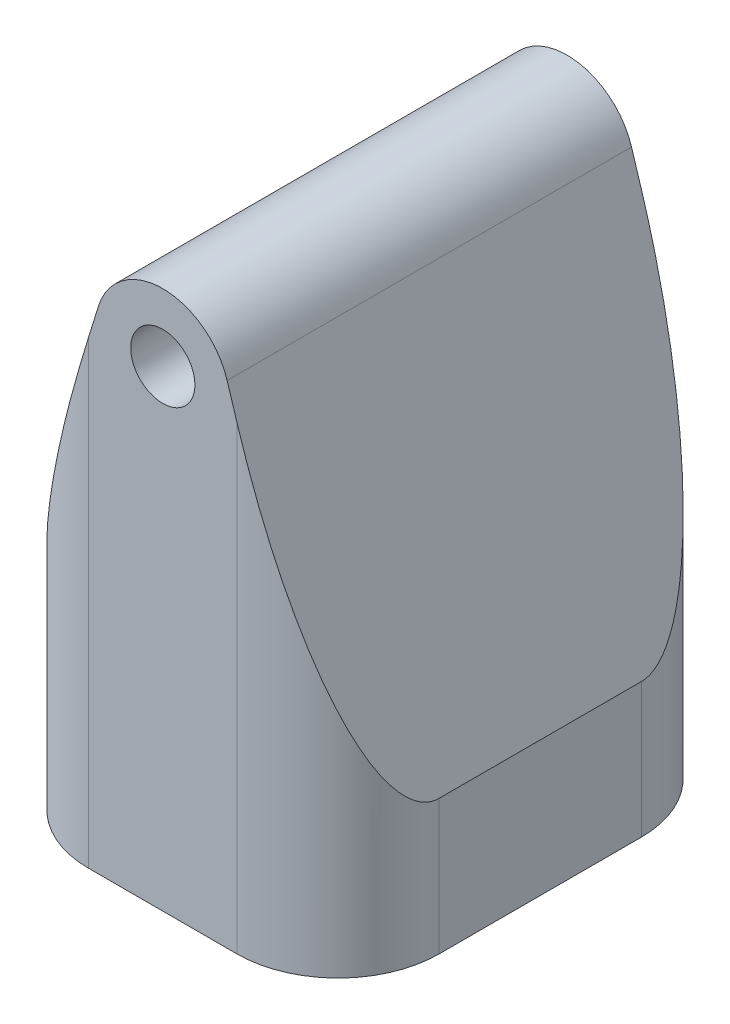
ISO-10303-21;
HEADER;
FILE_DESCRIPTION(('STEP AP214'),'2;1');
FILE_NAME('part.step','',(''),(''),'','','');
FILE_SCHEMA(('AUTOMOTIVE_DESIGN { 1 0 10303 214 1 1 1 1 }'));
ENDSEC;
DATA;
#1=APPLICATION_CONTEXT('core data for automotive mechanical design processes');
#2=APPLICATION_PROTOCOL_DEFINITION('international standard','automotive_design',2000,#1);
#3=PRODUCT_CONTEXT('',#1,'mechanical');
#4=PRODUCT('Part','Part','',(#3));
#5=PRODUCT_RELATED_PRODUCT_CATEGORY('part','',(#4));
#6=PRODUCT_DEFINITION_FORMATION('','',#4);
#7=PRODUCT_DEFINITION_CONTEXT('part definition',#1,'design');
#8=PRODUCT_DEFINITION('design','',#6,#7);
#9=PRODUCT_DEFINITION_SHAPE('','',#8);
#10=(LENGTH_UNIT() NAMED_UNIT(*) SI_UNIT(.MILLI.,.METRE.));
#11=(NAMED_UNIT(*) PLANE_ANGLE_UNIT() SI_UNIT($,.RADIAN.));
#12=(NAMED_UNIT(*) SI_UNIT($,.STERADIAN.) SOLID_ANGLE_UNIT());
#13=UNCERTAINTY_MEASURE_WITH_UNIT(LENGTH_MEASURE(1.E-05),#10,'distance_accuracy_value','');
#14=(GEOMETRIC_REPRESENTATION_CONTEXT(3) GLOBAL_UNCERTAINTY_ASSIGNED_CONTEXT((#13)) GLOBAL_UNIT_ASSIGNED_CONTEXT((#10,
#11,#12)) REPRESENTATION_CONTEXT('',''));
#15=CARTESIAN_POINT('',(0.,0.,0.));
#16=DIRECTION('',(0.,0.,1.));
#17=DIRECTION('',(1.,0.,0.));
#18=AXIS2_PLACEMENT_3D('',#15,#16,#17);
#19=CARTESIAN_POINT('',(13.,-20.,-15.));
#20=DIRECTION('',(0.,0.,1.));
#21=DIRECTION('',(1.,0.,0.));
#22=AXIS2_PLACEMENT_3D('',#19,#20,#21);
#23=PLANE('',#22);
#24=CARTESIAN_POINT('',(0.,15.,-15.));
#25=DIRECTION('',(0.,0.,1.));
#26=DIRECTION('',(1.,0.,0.));
#27=AXIS2_PLACEMENT_3D('',#24,#25,#26);
#28=CIRCLE('',#27,2.38125);
#29=CARTESIAN_POINT('',(2.38125,15.,-15.));
#30=VERTEX_POINT('',#29);
#31=EDGE_CURVE('E202',#30,#30,#28,.T.);
#32=ORIENTED_EDGE('',*,*,#31,.T.);
#33=EDGE_LOOP('',(#32));
#34=FACE_BOUND('',#33,.T.);
#35=DIRECTION('',(-1.,0.,0.));
#36=VECTOR('',#35,1.);
#37=CARTESIAN_POINT('',(13.,-20.,-15.));
#38=LINE('',#37,#36);
#39=CARTESIAN_POINT('',(5.5,-20.,-15.));
#40=VERTEX_POINT('',#39);
#41=CARTESIAN_POINT('',(-5.5,-20.,-15.));
#42=VERTEX_POINT('',#41);
#43=EDGE_CURVE('E227',#40,#42,#38,.T.);
#44=ORIENTED_EDGE('',*,*,#43,.T.);
#45=DIRECTION('',(0.,1.,0.));
#46=VECTOR('',#45,1.);
#47=CARTESIAN_POINT('',(-5.5,-10.,-15.));
#48=LINE('',#47,#46);
#49=CARTESIAN_POINT('',(-5.5,14.1486586582615,-15.));
#50=VERTEX_POINT('',#49);
#51=EDGE_CURVE('E240',#42,#50,#48,.T.);
#52=ORIENTED_EDGE('',*,*,#51,.T.);
#53=DIRECTION('',(0.296600806322939,0.955001550621036,0.));
#54=VECTOR('',#53,1.);
#55=CARTESIAN_POINT('',(-9.02382120241302,2.80258460628595,-15.));
#56=LINE('',#55,#54);
#57=CARTESIAN_POINT('',(-4.77500775310518,16.4830040316147,-15.));
#58=VERTEX_POINT('',#57);
#59=EDGE_CURVE('E183',#50,#58,#56,.T.);
#60=ORIENTED_EDGE('',*,*,#59,.T.);
#61=CARTESIAN_POINT('',(0.,15.,-15.));
#62=DIRECTION('',(0.,0.,1.));
#63=DIRECTION('',(1.,0.,0.));
#64=AXIS2_PLACEMENT_3D('',#61,#62,#63);
#65=CIRCLE('',#64,5.);
#66=CARTESIAN_POINT('',(4.77500775310518,16.4830040316147,-15.));
#67=VERTEX_POINT('',#66);
#68=EDGE_CURVE('E179',#58,#67,#65,.F.);
#69=ORIENTED_EDGE('',*,*,#68,.T.);
#70=DIRECTION('',(-0.296600806322939,0.955001550621036,0.));
#71=VECTOR('',#70,1.);
#72=CARTESIAN_POINT('',(9.02382120241302,2.80258460628595,-15.));
#73=LINE('',#72,#71);
#74=CARTESIAN_POINT('',(5.5,14.1486586582615,-15.));
#75=VERTEX_POINT('',#74);
#76=EDGE_CURVE('E169',#75,#67,#73,.T.);
#77=ORIENTED_EDGE('',*,*,#76,.F.);
#78=DIRECTION('',(0.,1.,0.));
#79=VECTOR('',#78,1.);
#80=CARTESIAN_POINT('',(5.5,-20.,-15.));
#81=LINE('',#80,#79);
#82=EDGE_CURVE('E237',#75,#40,#81,.F.);
#83=ORIENTED_EDGE('',*,*,#82,.T.);
#84=EDGE_LOOP('',(#44,#52,#60,#69,#77,#83));
#85=FACE_BOUND('',#84,.T.);
#86=ADVANCED_FACE('F92',(#34,#85),#23,.F.);
#87=CARTESIAN_POINT('',(13.,-20.,15.));
#88=DIRECTION('',(0.,0.,-1.));
#89=DIRECTION('',(-1.,0.,0.));
#90=AXIS2_PLACEMENT_3D('',#87,#88,#89);
#91=PLANE('',#90);
#92=CARTESIAN_POINT('',(0.,15.,15.));
#93=DIRECTION('',(0.,0.,1.));
#94=DIRECTION('',(1.,0.,0.));
#95=AXIS2_PLACEMENT_3D('',#92,#93,#94);
#96=CIRCLE('',#95,2.38125);
#97=CARTESIAN_POINT('',(2.38125,15.,15.));
#98=VERTEX_POINT('',#97);
#99=EDGE_CURVE('E198',#98,#98,#96,.T.);
#100=ORIENTED_EDGE('',*,*,#99,.F.);
#101=EDGE_LOOP('',(#100));
#102=FACE_BOUND('',#101,.T.);
#103=DIRECTION('',(0.296600806322939,0.955001550621036,0.));
#104=VECTOR('',#103,1.);
#105=CARTESIAN_POINT('',(-9.02382120241302,2.80258460628595,15.));
#106=LINE('',#105,#104);
#107=CARTESIAN_POINT('',(-5.5,14.1486586582615,15.));
#108=VERTEX_POINT('',#107);
#109=CARTESIAN_POINT('',(-4.77500775310518,16.4830040316147,15.));
#110=VERTEX_POINT('',#109);
#111=EDGE_CURVE('E206',#108,#110,#106,.T.);
#112=ORIENTED_EDGE('',*,*,#111,.F.);
#113=DIRECTION('',(0.,-1.,0.));
#114=VECTOR('',#113,1.);
#115=CARTESIAN_POINT('',(-5.5,-20.,15.));
#116=LINE('',#115,#114);
#117=CARTESIAN_POINT('',(-5.5,-20.,15.));
#118=VERTEX_POINT('',#117);
#119=EDGE_CURVE('E270',#108,#118,#116,.T.);
#120=ORIENTED_EDGE('',*,*,#119,.T.);
#121=DIRECTION('',(-1.,0.,0.));
#122=VECTOR('',#121,1.);
#123=CARTESIAN_POINT('',(13.,-20.,15.));
#124=LINE('',#123,#122);
#125=CARTESIAN_POINT('',(5.5,-20.,15.));
#126=VERTEX_POINT('',#125);
#127=EDGE_CURVE('E233',#126,#118,#124,.T.);
#128=ORIENTED_EDGE('',*,*,#127,.F.);
#129=DIRECTION('',(0.,-1.,0.));
#130=VECTOR('',#129,1.);
#131=CARTESIAN_POINT('',(5.5,-20.,15.));
#132=LINE('',#131,#130);
#133=CARTESIAN_POINT('',(5.5,14.1486586582615,15.));
#134=VERTEX_POINT('',#133);
#135=EDGE_CURVE('E267',#126,#134,#132,.F.);
#136=ORIENTED_EDGE('',*,*,#135,.T.);
#137=DIRECTION('',(-0.296600806322939,0.955001550621036,0.));
#138=VECTOR('',#137,1.);
#139=CARTESIAN_POINT('',(9.02382120241302,2.80258460628595,15.));
#140=LINE('',#139,#138);
#141=CARTESIAN_POINT('',(4.77500775310518,16.4830040316147,15.));
#142=VERTEX_POINT('',#141);
#143=EDGE_CURVE('E176',#134,#142,#140,.T.);
#144=ORIENTED_EDGE('',*,*,#143,.T.);
#145=CARTESIAN_POINT('',(0.,15.,15.));
#146=DIRECTION('',(0.,0.,1.));
#147=DIRECTION('',(1.,0.,0.));
#148=AXIS2_PLACEMENT_3D('',#145,#146,#147);
#149=CIRCLE('',#148,5.);
#150=EDGE_CURVE('E193',#110,#142,#149,.F.);
#151=ORIENTED_EDGE('',*,*,#150,.F.);
#152=EDGE_LOOP('',(#112,#120,#128,#136,#144,#151));
#153=FACE_BOUND('',#152,.T.);
#154=ADVANCED_FACE('F309',(#102,#153),#91,.F.);
#155=CARTESIAN_POINT('',(13.,0.,0.));
#156=DIRECTION('',(-1.,0.,0.));
#157=DIRECTION('',(0.,0.,1.));
#158=AXIS2_PLACEMENT_3D('',#155,#156,#157);
#159=PLANE('',#158);
#160=DIRECTION('',(0.,0.,1.));
#161=VECTOR('',#160,1.);
#162=CARTESIAN_POINT('',(13.,-10.,-15.));
#163=LINE('',#162,#161);
#164=CARTESIAN_POINT('',(13.,-10.,-7.5));
#165=VERTEX_POINT('',#164);
#166=CARTESIAN_POINT('',(13.,-10.,7.5));
#167=VERTEX_POINT('',#166);
#168=EDGE_CURVE('E195',#165,#167,#163,.T.);
#169=ORIENTED_EDGE('',*,*,#168,.T.);
#170=DIRECTION('',(0.,-1.,0.));
#171=VECTOR('',#170,1.);
#172=CARTESIAN_POINT('',(13.,0.,7.5));
#173=LINE('',#172,#171);
#174=CARTESIAN_POINT('',(13.,-20.,7.5));
#175=VERTEX_POINT('',#174);
#176=EDGE_CURVE('E277',#167,#175,#173,.T.);
#177=ORIENTED_EDGE('',*,*,#176,.T.);
#178=DIRECTION('',(0.,0.,-1.));
#179=VECTOR('',#178,1.);
#180=CARTESIAN_POINT('',(13.,-20.,15.));
#181=LINE('',#180,#179);
#182=CARTESIAN_POINT('',(13.,-20.,-7.5));
#183=VERTEX_POINT('',#182);
#184=EDGE_CURVE('E223',#175,#183,#181,.T.);
#185=ORIENTED_EDGE('',*,*,#184,.T.);
#186=DIRECTION('',(0.,1.,0.));
#187=VECTOR('',#186,1.);
#188=CARTESIAN_POINT('',(13.,0.,-7.5));
#189=LINE('',#188,#187);
#190=EDGE_CURVE('E274',#183,#165,#189,.T.);
#191=ORIENTED_EDGE('',*,*,#190,.T.);
#192=EDGE_LOOP('',(#169,#177,#185,#191));
#193=FACE_BOUND('',#192,.T.);
#194=ADVANCED_FACE('F284',(#193),#159,.F.);
#195=CARTESIAN_POINT('',(13.,-20.,15.));
#196=DIRECTION('',(0.,1.,0.));
#197=DIRECTION('',(0.,0.,1.));
#198=AXIS2_PLACEMENT_3D('',#195,#196,#197);
#199=PLANE('',#198);
#200=CARTESIAN_POINT('',(0.,-20.,10.));
#201=DIRECTION('',(0.,-1.,0.));
#202=DIRECTION('',(0.,0.,-1.));
#203=AXIS2_PLACEMENT_3D('',#200,#201,#202);
#204=CIRCLE('',#203,2.8067);
#205=CARTESIAN_POINT('',(0.,-20.,7.1933));
#206=VERTEX_POINT('',#205);
#207=EDGE_CURVE('E315',#206,#206,#204,.T.);
#208=ORIENTED_EDGE('',*,*,#207,.F.);
#209=EDGE_LOOP('',(#208));
#210=FACE_BOUND('',#209,.T.);
#211=CARTESIAN_POINT('',(0.,-20.,-10.));
#212=DIRECTION('',(0.,-1.,0.));
#213=DIRECTION('',(0.,0.,-1.));
#214=AXIS2_PLACEMENT_3D('',#211,#212,#213);
#215=CIRCLE('',#214,2.8067);
#216=CARTESIAN_POINT('',(0.,-20.,-12.8067));
#217=VERTEX_POINT('',#216);
#218=EDGE_CURVE('E334',#217,#217,#215,.T.);
#219=ORIENTED_EDGE('',*,*,#218,.F.);
#220=EDGE_LOOP('',(#219));
#221=FACE_BOUND('',#220,.T.);
#222=CARTESIAN_POINT('',(-10.,-20.,0.));
#223=DIRECTION('',(0.,-1.,0.));
#224=DIRECTION('',(0.,0.,-1.));
#225=AXIS2_PLACEMENT_3D('',#222,#223,#224);
#226=CIRCLE('',#225,2.8067);
#227=CARTESIAN_POINT('',(-10.,-20.,-2.8067));
#228=VERTEX_POINT('',#227);
#229=EDGE_CURVE('E326',#228,#228,#226,.T.);
#230=ORIENTED_EDGE('',*,*,#229,.F.);
#231=EDGE_LOOP('',(#230));
#232=FACE_BOUND('',#231,.T.);
#233=CARTESIAN_POINT('',(10.,-20.,0.));
#234=DIRECTION('',(0.,-1.,0.));
#235=DIRECTION('',(0.,0.,-1.));
#236=AXIS2_PLACEMENT_3D('',#233,#234,#235);
#237=CIRCLE('',#236,2.8067);
#238=CARTESIAN_POINT('',(10.,-20.,-2.8067));
#239=VERTEX_POINT('',#238);
#240=EDGE_CURVE('E318',#239,#239,#237,.T.);
#241=ORIENTED_EDGE('',*,*,#240,.F.);
#242=EDGE_LOOP('',(#241));
#243=FACE_BOUND('',#242,.T.);
#244=DIRECTION('',(0.,0.,-1.));
#245=VECTOR('',#244,1.);
#246=CARTESIAN_POINT('',(-13.,-20.,15.));
#247=LINE('',#246,#245);
#248=CARTESIAN_POINT('',(-13.,-20.,7.5));
#249=VERTEX_POINT('',#248);
#250=CARTESIAN_POINT('',(-13.,-20.,-7.5));
#251=VERTEX_POINT('',#250);
#252=EDGE_CURVE('E220',#249,#251,#247,.T.);
#253=ORIENTED_EDGE('',*,*,#252,.T.);
#254=CARTESIAN_POINT('',(-5.5,-20.,-7.5));
#255=DIRECTION('',(0.,1.,0.));
#256=DIRECTION('',(0.,0.,1.));
#257=AXIS2_PLACEMENT_3D('',#254,#255,#256);
#258=CIRCLE('',#257,7.5);
#259=EDGE_CURVE('E264',#251,#42,#258,.F.);
#260=ORIENTED_EDGE('',*,*,#259,.T.);
#261=ORIENTED_EDGE('',*,*,#43,.F.);
#262=CARTESIAN_POINT('',(5.5,-20.,-7.5));
#263=DIRECTION('',(0.,1.,0.));
#264=DIRECTION('',(0.,0.,1.));
#265=AXIS2_PLACEMENT_3D('',#262,#263,#264);
#266=CIRCLE('',#265,7.5);
#267=EDGE_CURVE('E255',#40,#183,#266,.F.);
#268=ORIENTED_EDGE('',*,*,#267,.T.);
#269=ORIENTED_EDGE('',*,*,#184,.F.);
#270=CARTESIAN_POINT('',(5.5,-20.,7.5));
#271=DIRECTION('',(0.,1.,0.));
#272=DIRECTION('',(0.,0.,1.));
#273=AXIS2_PLACEMENT_3D('',#270,#271,#272);
#274=CIRCLE('',#273,7.5);
#275=EDGE_CURVE('E258',#175,#126,#274,.F.);
#276=ORIENTED_EDGE('',*,*,#275,.T.);
#277=ORIENTED_EDGE('',*,*,#127,.T.);
#278=CARTESIAN_POINT('',(-5.5,-20.,7.5));
#279=DIRECTION('',(0.,1.,0.));
#280=DIRECTION('',(0.,0.,1.));
#281=AXIS2_PLACEMENT_3D('',#278,#279,#280);
#282=CIRCLE('',#281,7.5);
#283=EDGE_CURVE('E261',#118,#249,#282,.F.);
#284=ORIENTED_EDGE('',*,*,#283,.T.);
#285=EDGE_LOOP('',(#253,#260,#261,#268,#269,#276,#277,#284));
#286=FACE_BOUND('',#285,.T.);
#287=ADVANCED_FACE('F287',(#210,#221,#232,#243,#286),#199,.F.);
#288=CARTESIAN_POINT('',(-13.,0.,0.));
#289=DIRECTION('',(-1.,0.,0.));
#290=DIRECTION('',(0.,0.,1.));
#291=AXIS2_PLACEMENT_3D('',#288,#289,#290);
#292=PLANE('',#291);
#293=DIRECTION('',(0.,0.,1.));
#294=VECTOR('',#293,1.);
#295=CARTESIAN_POINT('',(-13.,-10.,-15.));
#296=LINE('',#295,#294);
#297=CARTESIAN_POINT('',(-13.,-10.,-7.5));
#298=VERTEX_POINT('',#297);
#299=CARTESIAN_POINT('',(-13.,-10.,7.5));
#300=VERTEX_POINT('',#299);
#301=EDGE_CURVE('E216',#298,#300,#296,.T.);
#302=ORIENTED_EDGE('',*,*,#301,.F.);
#303=DIRECTION('',(0.,1.,0.));
#304=VECTOR('',#303,1.);
#305=CARTESIAN_POINT('',(-13.,-20.,-7.5));
#306=LINE('',#305,#304);
#307=EDGE_CURVE('E252',#298,#251,#306,.F.);
#308=ORIENTED_EDGE('',*,*,#307,.T.);
#309=ORIENTED_EDGE('',*,*,#252,.F.);
#310=DIRECTION('',(0.,-1.,0.));
#311=VECTOR('',#310,1.);
#312=CARTESIAN_POINT('',(-13.,-10.,7.5));
#313=LINE('',#312,#311);
#314=EDGE_CURVE('E249',#249,#300,#313,.F.);
#315=ORIENTED_EDGE('',*,*,#314,.T.);
#316=EDGE_LOOP('',(#302,#308,#309,#315));
#317=FACE_BOUND('',#316,.T.);
#318=ADVANCED_FACE('F301',(#317),#292,.T.);
#319=CARTESIAN_POINT('',(-9.02382120241302,2.80258460628595,-15.));
#320=DIRECTION('',(0.955001550621036,-0.296600806322939,0.));
#321=DIRECTION('',(0.296600806322939,0.955001550621036,0.));
#322=AXIS2_PLACEMENT_3D('',#319,#320,#321);
#323=PLANE('',#322);
#324=ORIENTED_EDGE('',*,*,#59,.F.);
#325=CARTESIAN_POINT('',(-5.5,14.1486586582615,-7.5));
#326=DIRECTION('',(0.955001550621036,-0.296600806322939,0.));
#327=DIRECTION('',(-0.296600806322939,-0.955001550621036,0.));
#328=AXIS2_PLACEMENT_3D('',#325,#326,#327);
#329=ELLIPSE('',#328,25.2865125114798,7.5);
#330=EDGE_CURVE('E246',#50,#298,#329,.F.);
#331=ORIENTED_EDGE('',*,*,#330,.T.);
#332=ORIENTED_EDGE('',*,*,#301,.T.);
#333=CARTESIAN_POINT('',(-5.5,14.1486586582615,7.5));
#334=DIRECTION('',(0.955001550621036,-0.296600806322939,0.));
#335=DIRECTION('',(0.296600806322939,0.955001550621036,0.));
#336=AXIS2_PLACEMENT_3D('',#333,#334,#335);
#337=ELLIPSE('',#336,25.2865125114798,7.5);
#338=EDGE_CURVE('E243',#300,#108,#337,.F.);
#339=ORIENTED_EDGE('',*,*,#338,.T.);
#340=ORIENTED_EDGE('',*,*,#111,.T.);
#341=DIRECTION('',(0.,0.,1.));
#342=VECTOR('',#341,1.);
#343=CARTESIAN_POINT('',(-4.77500775310518,16.4830040316147,-15.));
#344=LINE('',#343,#342);
#345=EDGE_CURVE('E188',#58,#110,#344,.T.);
#346=ORIENTED_EDGE('',*,*,#345,.F.);
#347=EDGE_LOOP('',(#324,#331,#332,#339,#340,#346));
#348=FACE_BOUND('',#347,.T.);
#349=ADVANCED_FACE('F298',(#348),#323,.F.);
#350=CARTESIAN_POINT('',(0.,15.,-15.));
#351=DIRECTION('',(0.,0.,1.));
#352=DIRECTION('',(1.,0.,0.));
#353=AXIS2_PLACEMENT_3D('',#350,#351,#352);
#354=CYLINDRICAL_SURFACE('',#353,5.);
#355=ORIENTED_EDGE('',*,*,#150,.T.);
#356=DIRECTION('',(0.,0.,1.));
#357=VECTOR('',#356,1.);
#358=CARTESIAN_POINT('',(4.77500775310518,16.4830040316147,-15.));
#359=LINE('',#358,#357);
#360=EDGE_CURVE('E173',#67,#142,#359,.T.);
#361=ORIENTED_EDGE('',*,*,#360,.F.);
#362=ORIENTED_EDGE('',*,*,#68,.F.);
#363=ORIENTED_EDGE('',*,*,#345,.T.);
#364=EDGE_LOOP('',(#355,#361,#362,#363));
#365=FACE_BOUND('',#364,.T.);
#366=ADVANCED_FACE('F191',(#365),#354,.T.);
#367=CARTESIAN_POINT('',(9.02382120241302,2.80258460628595,-15.));
#368=DIRECTION('',(0.955001550621036,0.296600806322939,0.));
#369=DIRECTION('',(-0.296600806322939,0.955001550621036,0.));
#370=AXIS2_PLACEMENT_3D('',#367,#368,#369);
#371=PLANE('',#370);
#372=ORIENTED_EDGE('',*,*,#143,.F.);
#373=CARTESIAN_POINT('',(5.5,14.1486586582615,7.5));
#374=DIRECTION('',(0.955001550621036,0.296600806322939,0.));
#375=DIRECTION('',(0.296600806322939,-0.955001550621036,0.));
#376=AXIS2_PLACEMENT_3D('',#373,#374,#375);
#377=ELLIPSE('',#376,25.2865125114798,7.5);
#378=EDGE_CURVE('E12',#134,#167,#377,.T.);
#379=ORIENTED_EDGE('',*,*,#378,.T.);
#380=ORIENTED_EDGE('',*,*,#168,.F.);
#381=CARTESIAN_POINT('',(5.5,14.1486586582615,-7.5));
#382=DIRECTION('',(0.955001550621036,0.296600806322939,0.));
#383=DIRECTION('',(-0.296600806322939,0.955001550621036,0.));
#384=AXIS2_PLACEMENT_3D('',#381,#382,#383);
#385=ELLIPSE('',#384,25.2865125114798,7.5);
#386=EDGE_CURVE('E101',#165,#75,#385,.T.);
#387=ORIENTED_EDGE('',*,*,#386,.T.);
#388=ORIENTED_EDGE('',*,*,#76,.T.);
#389=ORIENTED_EDGE('',*,*,#360,.T.);
#390=EDGE_LOOP('',(#372,#379,#380,#387,#388,#389));
#391=FACE_BOUND('',#390,.T.);
#392=ADVANCED_FACE('F171',(#391),#371,.T.);
#393=CARTESIAN_POINT('',(0.,15.,-15.));
#394=DIRECTION('',(0.,0.,1.));
#395=DIRECTION('',(1.,0.,0.));
#396=AXIS2_PLACEMENT_3D('',#393,#394,#395);
#397=CYLINDRICAL_SURFACE('',#396,2.38125);
#398=ORIENTED_EDGE('',*,*,#31,.F.);
#399=EDGE_LOOP('',(#398));
#400=FACE_BOUND('',#399,.T.);
#401=ORIENTED_EDGE('',*,*,#99,.T.);
#402=EDGE_LOOP('',(#401));
#403=FACE_BOUND('',#402,.T.);
#404=ADVANCED_FACE('F360',(#400,#403),#397,.F.);
#405=CARTESIAN_POINT('',(10.,-10.,0.));
#406=DIRECTION('',(0.,-1.,0.));
#407=DIRECTION('',(0.,0.,-1.));
#408=AXIS2_PLACEMENT_3D('',#405,#406,#407);
#409=CYLINDRICAL_SURFACE('',#408,2.8067);
#410=CARTESIAN_POINT('',(10.,-10.,0.));
#411=DIRECTION('',(0.,-1.,0.));
#412=DIRECTION('',(0.,0.,-1.));
#413=AXIS2_PLACEMENT_3D('',#410,#411,#412);
#414=CIRCLE('',#413,2.8067);
#415=CARTESIAN_POINT('',(10.,-10.,-2.8067));
#416=VERTEX_POINT('',#415);
#417=EDGE_CURVE('E322',#416,#416,#414,.T.);
#418=ORIENTED_EDGE('',*,*,#417,.F.);
#419=EDGE_LOOP('',(#418));
#420=FACE_BOUND('',#419,.T.);
#421=ORIENTED_EDGE('',*,*,#240,.T.);
#422=EDGE_LOOP('',(#421));
#423=FACE_BOUND('',#422,.T.);
#424=ADVANCED_FACE('F357',(#420,#423),#409,.F.);
#425=CARTESIAN_POINT('',(10.,-10.,0.));
#426=DIRECTION('',(0.,-1.,0.));
#427=DIRECTION('',(0.,0.,-1.));
#428=AXIS2_PLACEMENT_3D('',#425,#426,#427);
#429=PLANE('',#428);
#430=ORIENTED_EDGE('',*,*,#417,.T.);
#431=EDGE_LOOP('',(#430));
#432=FACE_BOUND('',#431,.T.);
#433=ADVANCED_FACE('F359',(#432),#429,.T.);
#434=CARTESIAN_POINT('',(-10.,-10.,0.));
#435=DIRECTION('',(0.,-1.,0.));
#436=DIRECTION('',(0.,0.,-1.));
#437=AXIS2_PLACEMENT_3D('',#434,#435,#436);
#438=CYLINDRICAL_SURFACE('',#437,2.8067);
#439=CARTESIAN_POINT('',(-10.,-10.,0.));
#440=DIRECTION('',(0.,-1.,0.));
#441=DIRECTION('',(0.,0.,-1.));
#442=AXIS2_PLACEMENT_3D('',#439,#440,#441);
#443=CIRCLE('',#442,2.8067);
#444=CARTESIAN_POINT('',(-10.,-10.,-2.8067));
#445=VERTEX_POINT('',#444);
#446=EDGE_CURVE('E330',#445,#445,#443,.T.);
#447=ORIENTED_EDGE('',*,*,#446,.F.);
#448=EDGE_LOOP('',(#447));
#449=FACE_BOUND('',#448,.T.);
#450=ORIENTED_EDGE('',*,*,#229,.T.);
#451=EDGE_LOOP('',(#450));
#452=FACE_BOUND('',#451,.T.);
#453=ADVANCED_FACE('F367',(#449,#452),#438,.F.);
#454=CARTESIAN_POINT('',(-10.,-10.,0.));
#455=DIRECTION('',(0.,-1.,0.));
#456=DIRECTION('',(0.,0.,-1.));
#457=AXIS2_PLACEMENT_3D('',#454,#455,#456);
#458=PLANE('',#457);
#459=ORIENTED_EDGE('',*,*,#446,.T.);
#460=EDGE_LOOP('',(#459));
#461=FACE_BOUND('',#460,.T.);
#462=ADVANCED_FACE('F488',(#461),#458,.T.);
#463=CARTESIAN_POINT('',(0.,-10.,-10.));
#464=DIRECTION('',(0.,-1.,0.));
#465=DIRECTION('',(0.,0.,-1.));
#466=AXIS2_PLACEMENT_3D('',#463,#464,#465);
#467=CYLINDRICAL_SURFACE('',#466,2.8067);
#468=CARTESIAN_POINT('',(0.,-10.,-10.));
#469=DIRECTION('',(0.,-1.,0.));
#470=DIRECTION('',(0.,0.,-1.));
#471=AXIS2_PLACEMENT_3D('',#468,#469,#470);
#472=CIRCLE('',#471,2.8067);
#473=CARTESIAN_POINT('',(0.,-10.,-12.8067));
#474=VERTEX_POINT('',#473);
#475=EDGE_CURVE('E338',#474,#474,#472,.T.);
#476=ORIENTED_EDGE('',*,*,#475,.F.);
#477=EDGE_LOOP('',(#476));
#478=FACE_BOUND('',#477,.T.);
#479=ORIENTED_EDGE('',*,*,#218,.T.);
#480=EDGE_LOOP('',(#479));
#481=FACE_BOUND('',#480,.T.);
#482=ADVANCED_FACE('F497',(#478,#481),#467,.F.);
#483=CARTESIAN_POINT('',(0.,-10.,-10.));
#484=DIRECTION('',(0.,-1.,0.));
#485=DIRECTION('',(0.,0.,-1.));
#486=AXIS2_PLACEMENT_3D('',#483,#484,#485);
#487=PLANE('',#486);
#488=ORIENTED_EDGE('',*,*,#475,.T.);
#489=EDGE_LOOP('',(#488));
#490=FACE_BOUND('',#489,.T.);
#491=ADVANCED_FACE('F506',(#490),#487,.T.);
#492=CARTESIAN_POINT('',(0.,-10.,10.));
#493=DIRECTION('',(0.,-1.,0.));
#494=DIRECTION('',(0.,0.,-1.));
#495=AXIS2_PLACEMENT_3D('',#492,#493,#494);
#496=CYLINDRICAL_SURFACE('',#495,2.8067);
#497=CARTESIAN_POINT('',(0.,-10.,10.));
#498=DIRECTION('',(0.,-1.,0.));
#499=DIRECTION('',(0.,0.,-1.));
#500=AXIS2_PLACEMENT_3D('',#497,#498,#499);
#501=CIRCLE('',#500,2.8067);
#502=CARTESIAN_POINT('',(0.,-10.,7.1933));
#503=VERTEX_POINT('',#502);
#504=EDGE_CURVE('E312',#503,#503,#501,.T.);
#505=ORIENTED_EDGE('',*,*,#504,.F.);
#506=EDGE_LOOP('',(#505));
#507=FACE_BOUND('',#506,.T.);
#508=ORIENTED_EDGE('',*,*,#207,.T.);
#509=EDGE_LOOP('',(#508));
#510=FACE_BOUND('',#509,.T.);
#511=ADVANCED_FACE('F346',(#507,#510),#496,.F.);
#512=CARTESIAN_POINT('',(0.,-10.,10.));
#513=DIRECTION('',(0.,-1.,0.));
#514=DIRECTION('',(0.,0.,-1.));
#515=AXIS2_PLACEMENT_3D('',#512,#513,#514);
#516=PLANE('',#515);
#517=ORIENTED_EDGE('',*,*,#504,.T.);
#518=EDGE_LOOP('',(#517));
#519=FACE_BOUND('',#518,.T.);
#520=ADVANCED_FACE('F386',(#519),#516,.T.);
#521=CARTESIAN_POINT('',(-5.5,-20.,-7.5));
#522=DIRECTION('',(0.,-1.,0.));
#523=DIRECTION('',(0.,0.,-1.));
#524=AXIS2_PLACEMENT_3D('',#521,#522,#523);
#525=CYLINDRICAL_SURFACE('',#524,7.5);
#526=ORIENTED_EDGE('',*,*,#259,.F.);
#527=ORIENTED_EDGE('',*,*,#307,.F.);
#528=ORIENTED_EDGE('',*,*,#330,.F.);
#529=ORIENTED_EDGE('',*,*,#51,.F.);
#530=EDGE_LOOP('',(#526,#527,#528,#529));
#531=FACE_BOUND('',#530,.T.);
#532=ADVANCED_FACE('F294',(#531),#525,.T.);
#533=CARTESIAN_POINT('',(-5.5,-20.,7.5));
#534=DIRECTION('',(0.,1.,0.));
#535=DIRECTION('',(0.,0.,1.));
#536=AXIS2_PLACEMENT_3D('',#533,#534,#535);
#537=CYLINDRICAL_SURFACE('',#536,7.5);
#538=ORIENTED_EDGE('',*,*,#338,.F.);
#539=ORIENTED_EDGE('',*,*,#314,.F.);
#540=ORIENTED_EDGE('',*,*,#283,.F.);
#541=ORIENTED_EDGE('',*,*,#119,.F.);
#542=EDGE_LOOP('',(#538,#539,#540,#541));
#543=FACE_BOUND('',#542,.T.);
#544=ADVANCED_FACE('F305',(#543),#537,.T.);
#545=CARTESIAN_POINT('',(5.5,0.,7.5));
#546=DIRECTION('',(0.,-1.,0.));
#547=DIRECTION('',(0.,0.,-1.));
#548=AXIS2_PLACEMENT_3D('',#545,#546,#547);
#549=CYLINDRICAL_SURFACE('',#548,7.5);
#550=ORIENTED_EDGE('',*,*,#378,.F.);
#551=ORIENTED_EDGE('',*,*,#135,.F.);
#552=ORIENTED_EDGE('',*,*,#275,.F.);
#553=ORIENTED_EDGE('',*,*,#176,.F.);
#554=EDGE_LOOP('',(#550,#551,#552,#553));
#555=FACE_BOUND('',#554,.T.);
#556=ADVANCED_FACE('F388',(#555),#549,.T.);
#557=CARTESIAN_POINT('',(5.5,0.,-7.5));
#558=DIRECTION('',(0.,1.,0.));
#559=DIRECTION('',(0.,0.,1.));
#560=AXIS2_PLACEMENT_3D('',#557,#558,#559);
#561=CYLINDRICAL_SURFACE('',#560,7.5);
#562=ORIENTED_EDGE('',*,*,#267,.F.);
#563=ORIENTED_EDGE('',*,*,#82,.F.);
#564=ORIENTED_EDGE('',*,*,#386,.F.);
#565=ORIENTED_EDGE('',*,*,#190,.F.);
#566=EDGE_LOOP('',(#562,#563,#564,#565));
#567=FACE_BOUND('',#566,.T.);
#568=ADVANCED_FACE('F94',(#567),#561,.T.);
#569=CLOSED_SHELL('',(#86,#154,#194,#287,#318,#349,#366,#392,#404,#424,#433,#453,#462,#482,#491,
#511,#520,#532,#544,#556,#568));
#570=MANIFOLD_SOLID_BREP('B2',#569);
#571=ADVANCED_BREP_SHAPE_REPRESENTATION('',(#18,#570),#14);
#572=SHAPE_DEFINITION_REPRESENTATION(#9,#571);
ENDSEC;
END-ISO-10303-21;
